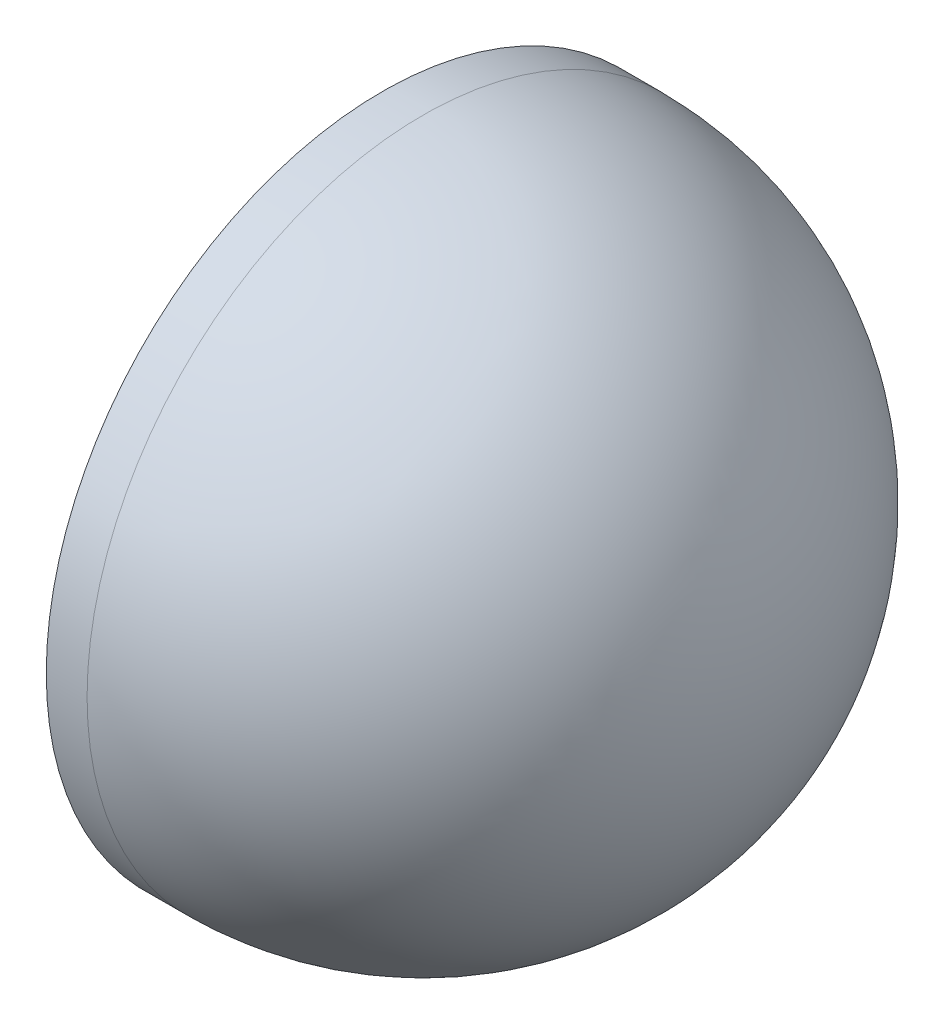
ISO-10303-21;
HEADER;
FILE_DESCRIPTION(('STEP AP214'),'2;1');
FILE_NAME('part.step','',(''),(''),'','','');
FILE_SCHEMA(('AUTOMOTIVE_DESIGN { 1 0 10303 214 1 1 1 1 }'));
ENDSEC;
DATA;
#1=APPLICATION_CONTEXT('core data for automotive mechanical design processes');
#2=APPLICATION_PROTOCOL_DEFINITION('international standard','automotive_design',2000,#1);
#3=PRODUCT_CONTEXT('',#1,'mechanical');
#4=PRODUCT('Part','Part','',(#3));
#5=PRODUCT_RELATED_PRODUCT_CATEGORY('part','',(#4));
#6=PRODUCT_DEFINITION_FORMATION('','',#4);
#7=PRODUCT_DEFINITION_CONTEXT('part definition',#1,'design');
#8=PRODUCT_DEFINITION('design','',#6,#7);
#9=PRODUCT_DEFINITION_SHAPE('','',#8);
#10=(LENGTH_UNIT() NAMED_UNIT(*) SI_UNIT(.MILLI.,.METRE.));
#11=(NAMED_UNIT(*) PLANE_ANGLE_UNIT() SI_UNIT($,.RADIAN.));
#12=(NAMED_UNIT(*) SI_UNIT($,.STERADIAN.) SOLID_ANGLE_UNIT());
#13=UNCERTAINTY_MEASURE_WITH_UNIT(LENGTH_MEASURE(1.E-05),#10,'distance_accuracy_value','');
#14=(GEOMETRIC_REPRESENTATION_CONTEXT(3) GLOBAL_UNCERTAINTY_ASSIGNED_CONTEXT((#13)) GLOBAL_UNIT_ASSIGNED_CONTEXT((#10,
#11,#12)) REPRESENTATION_CONTEXT('',''));
#15=CARTESIAN_POINT('',(0.,0.,0.));
#16=DIRECTION('',(0.,0.,1.));
#17=DIRECTION('',(1.,0.,0.));
#18=AXIS2_PLACEMENT_3D('',#15,#16,#17);
#19=CARTESIAN_POINT('',(0.,0.,0.));
#20=DIRECTION('',(-1.,0.,0.));
#21=DIRECTION('',(0.,-1.,0.));
#22=AXIS2_PLACEMENT_3D('',#19,#20,#21);
#23=SPHERICAL_SURFACE('',#22,776.);
#24=CARTESIAN_POINT('',(0.,0.,0.));
#25=DIRECTION('',(-1.,0.,0.));
#26=DIRECTION('',(0.,0.,1.));
#27=AXIS2_PLACEMENT_3D('',#24,#25,#26);
#28=CIRCLE('',#27,776.);
#29=CARTESIAN_POINT('',(0.,0.,776.));
#30=VERTEX_POINT('',#29);
#31=EDGE_CURVE('E56',#30,#30,#28,.T.);
#32=ORIENTED_EDGE('',*,*,#31,.T.);
#33=EDGE_LOOP('',(#32));
#34=FACE_BOUND('',#33,.T.);
#35=ADVANCED_FACE('F39',(#34),#23,.F.);
#36=CARTESIAN_POINT('',(0.,0.,0.));
#37=DIRECTION('',(-1.,0.,0.));
#38=DIRECTION('',(0.,-1.,0.));
#39=AXIS2_PLACEMENT_3D('',#36,#37,#38);
#40=SPHERICAL_SURFACE('',#39,823.);
#41=CARTESIAN_POINT('',(1.51182647354741E-13,0.,0.));
#42=DIRECTION('',(-1.,0.,0.));
#43=DIRECTION('',(0.,0.,1.));
#44=AXIS2_PLACEMENT_3D('',#41,#42,#43);
#45=CIRCLE('',#44,823.);
#46=CARTESIAN_POINT('',(1.51182647354741E-13,0.,823.));
#47=VERTEX_POINT('',#46);
#48=EDGE_CURVE('E10',#47,#47,#45,.T.);
#49=ORIENTED_EDGE('',*,*,#48,.F.);
#50=EDGE_LOOP('',(#49));
#51=FACE_BOUND('',#50,.T.);
#52=ADVANCED_FACE('F75',(#51),#40,.T.);
#53=CARTESIAN_POINT('',(0.,0.,0.));
#54=DIRECTION('',(-1.,0.,0.));
#55=DIRECTION('',(0.,0.,1.));
#56=AXIS2_PLACEMENT_3D('',#53,#54,#55);
#57=CYLINDRICAL_SURFACE('',#56,823.);
#58=ORIENTED_EDGE('',*,*,#48,.T.);
#59=EDGE_LOOP('',(#58));
#60=FACE_BOUND('',#59,.T.);
#61=CARTESIAN_POINT('',(-100.,0.,0.));
#62=DIRECTION('',(-1.,0.,0.));
#63=DIRECTION('',(0.,0.,1.));
#64=AXIS2_PLACEMENT_3D('',#61,#62,#63);
#65=CIRCLE('',#64,823.);
#66=CARTESIAN_POINT('',(-100.,0.,823.));
#67=VERTEX_POINT('',#66);
#68=EDGE_CURVE('E46',#67,#67,#65,.T.);
#69=ORIENTED_EDGE('',*,*,#68,.F.);
#70=EDGE_LOOP('',(#69));
#71=FACE_BOUND('',#70,.T.);
#72=ADVANCED_FACE('F72',(#60,#71),#57,.T.);
#73=CARTESIAN_POINT('',(-100.,-776.,0.));
#74=DIRECTION('',(-1.,0.,0.));
#75=DIRECTION('',(0.,0.,1.));
#76=AXIS2_PLACEMENT_3D('',#73,#74,#75);
#77=PLANE('',#76);
#78=ORIENTED_EDGE('',*,*,#68,.T.);
#79=EDGE_LOOP('',(#78));
#80=FACE_BOUND('',#79,.T.);
#81=CARTESIAN_POINT('',(-100.,0.,0.));
#82=DIRECTION('',(-1.,0.,0.));
#83=DIRECTION('',(0.,0.,1.));
#84=AXIS2_PLACEMENT_3D('',#81,#82,#83);
#85=CIRCLE('',#84,776.);
#86=CARTESIAN_POINT('',(-100.,0.,776.));
#87=VERTEX_POINT('',#86);
#88=EDGE_CURVE('E51',#87,#87,#85,.T.);
#89=ORIENTED_EDGE('',*,*,#88,.F.);
#90=EDGE_LOOP('',(#89));
#91=FACE_BOUND('',#90,.T.);
#92=ADVANCED_FACE('F66',(#80,#91),#77,.T.);
#93=CARTESIAN_POINT('',(0.,0.,0.));
#94=DIRECTION('',(-1.,0.,0.));
#95=DIRECTION('',(0.,0.,1.));
#96=AXIS2_PLACEMENT_3D('',#93,#94,#95);
#97=CYLINDRICAL_SURFACE('',#96,776.);
#98=ORIENTED_EDGE('',*,*,#88,.T.);
#99=EDGE_LOOP('',(#98));
#100=FACE_BOUND('',#99,.T.);
#101=ORIENTED_EDGE('',*,*,#31,.F.);
#102=EDGE_LOOP('',(#101));
#103=FACE_BOUND('',#102,.T.);
#104=ADVANCED_FACE('F64',(#100,#103),#97,.F.);
#105=CLOSED_SHELL('',(#35,#52,#72,#92,#104));
#106=MANIFOLD_SOLID_BREP('B2',#105);
#107=ADVANCED_BREP_SHAPE_REPRESENTATION('',(#18,#106),#14);
#108=SHAPE_DEFINITION_REPRESENTATION(#9,#107);
ENDSEC;
END-ISO-10303-21;
